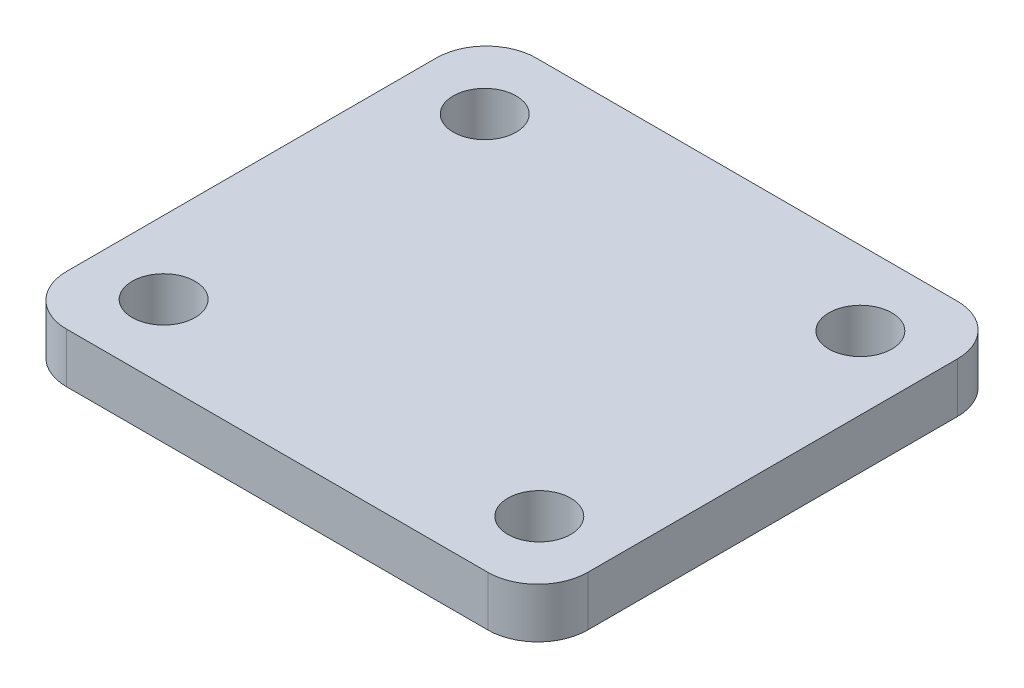
ISO-10303-21;
HEADER;
FILE_DESCRIPTION(('STEP AP214'),'2;1');
FILE_NAME('part.step','',(''),(''),'','','');
FILE_SCHEMA(('AUTOMOTIVE_DESIGN { 1 0 10303 214 1 1 1 1 }'));
ENDSEC;
DATA;
#1=APPLICATION_CONTEXT('core data for automotive mechanical design processes');
#2=APPLICATION_PROTOCOL_DEFINITION('international standard','automotive_design',2000,#1);
#3=PRODUCT_CONTEXT('',#1,'mechanical');
#4=PRODUCT('Part','Part','',(#3));
#5=PRODUCT_RELATED_PRODUCT_CATEGORY('part','',(#4));
#6=PRODUCT_DEFINITION_FORMATION('','',#4);
#7=PRODUCT_DEFINITION_CONTEXT('part definition',#1,'design');
#8=PRODUCT_DEFINITION('design','',#6,#7);
#9=PRODUCT_DEFINITION_SHAPE('','',#8);
#10=(LENGTH_UNIT() NAMED_UNIT(*) SI_UNIT(.MILLI.,.METRE.));
#11=(NAMED_UNIT(*) PLANE_ANGLE_UNIT() SI_UNIT($,.RADIAN.));
#12=(NAMED_UNIT(*) SI_UNIT($,.STERADIAN.) SOLID_ANGLE_UNIT());
#13=UNCERTAINTY_MEASURE_WITH_UNIT(LENGTH_MEASURE(1.E-05),#10,'distance_accuracy_value','');
#14=(GEOMETRIC_REPRESENTATION_CONTEXT(3) GLOBAL_UNCERTAINTY_ASSIGNED_CONTEXT((#13)) GLOBAL_UNIT_ASSIGNED_CONTEXT((#10,
#11,#12)) REPRESENTATION_CONTEXT('',''));
#15=CARTESIAN_POINT('',(0.,0.,0.));
#16=DIRECTION('',(0.,0.,1.));
#17=DIRECTION('',(1.,0.,0.));
#18=AXIS2_PLACEMENT_3D('',#15,#16,#17);
#19=CARTESIAN_POINT('',(10.709999957,2.54,-9.397499999));
#20=DIRECTION('',(0.,-1.,0.));
#21=DIRECTION('',(0.,0.,-1.));
#22=AXIS2_PLACEMENT_3D('',#19,#20,#21);
#23=CYLINDRICAL_SURFACE('',#22,2.54);
#24=CARTESIAN_POINT('',(10.709999957,0.,-9.397499999));
#25=DIRECTION('',(0.,1.,0.));
#26=DIRECTION('',(0.,0.,-1.));
#27=AXIS2_PLACEMENT_3D('',#24,#25,#26);
#28=CIRCLE('',#27,2.54);
#29=CARTESIAN_POINT('',(13.249999957,0.,-9.39749999899998));
#30=VERTEX_POINT('',#29);
#31=CARTESIAN_POINT('',(10.709999957,0.,-11.937499999));
#32=VERTEX_POINT('',#31);
#33=EDGE_CURVE('E133',#30,#32,#28,.T.);
#34=ORIENTED_EDGE('',*,*,#33,.T.);
#35=DIRECTION('',(0.,-1.,0.));
#36=VECTOR('',#35,1.);
#37=CARTESIAN_POINT('',(10.709999957,2.54,-11.937499999));
#38=LINE('',#37,#36);
#39=CARTESIAN_POINT('',(10.709999957,2.54,-11.937499999));
#40=VERTEX_POINT('',#39);
#41=EDGE_CURVE('E11',#40,#32,#38,.T.);
#42=ORIENTED_EDGE('',*,*,#41,.F.);
#43=CARTESIAN_POINT('',(10.709999957,2.54,-9.397499999));
#44=DIRECTION('',(0.,1.,0.));
#45=DIRECTION('',(0.,0.,-1.));
#46=AXIS2_PLACEMENT_3D('',#43,#44,#45);
#47=CIRCLE('',#46,2.54);
#48=CARTESIAN_POINT('',(13.249999957,2.54,-9.39749999899998));
#49=VERTEX_POINT('',#48);
#50=EDGE_CURVE('E148',#49,#40,#47,.T.);
#51=ORIENTED_EDGE('',*,*,#50,.F.);
#52=DIRECTION('',(0.,-1.,0.));
#53=VECTOR('',#52,1.);
#54=CARTESIAN_POINT('',(13.249999957,2.54,-9.39749999899998));
#55=LINE('',#54,#53);
#56=EDGE_CURVE('E129',#49,#30,#55,.T.);
#57=ORIENTED_EDGE('',*,*,#56,.T.);
#58=EDGE_LOOP('',(#34,#42,#51,#57));
#59=FACE_BOUND('',#58,.T.);
#60=ADVANCED_FACE('F37',(#59),#23,.T.);
#61=CARTESIAN_POINT('',(-10.710000043,2.54,-11.937499999));
#62=DIRECTION('',(0.,0.,1.));
#63=DIRECTION('',(1.,0.,0.));
#64=AXIS2_PLACEMENT_3D('',#61,#62,#63);
#65=PLANE('',#64);
#66=DIRECTION('',(-1.,0.,0.));
#67=VECTOR('',#66,1.);
#68=CARTESIAN_POINT('',(-10.710000043,0.,-11.937499999));
#69=LINE('',#68,#67);
#70=CARTESIAN_POINT('',(-10.710000043,0.,-11.937499999));
#71=VERTEX_POINT('',#70);
#72=EDGE_CURVE('E136',#32,#71,#69,.T.);
#73=ORIENTED_EDGE('',*,*,#72,.T.);
#74=DIRECTION('',(0.,-1.,0.));
#75=VECTOR('',#74,1.);
#76=CARTESIAN_POINT('',(-10.710000043,2.54,-11.937499999));
#77=LINE('',#76,#75);
#78=CARTESIAN_POINT('',(-10.710000043,2.54,-11.937499999));
#79=VERTEX_POINT('',#78);
#80=EDGE_CURVE('E45',#79,#71,#77,.T.);
#81=ORIENTED_EDGE('',*,*,#80,.F.);
#82=DIRECTION('',(-1.,0.,0.));
#83=VECTOR('',#82,1.);
#84=CARTESIAN_POINT('',(-10.710000043,2.54,-11.937499999));
#85=LINE('',#84,#83);
#86=EDGE_CURVE('E96',#40,#79,#85,.T.);
#87=ORIENTED_EDGE('',*,*,#86,.F.);
#88=ORIENTED_EDGE('',*,*,#41,.T.);
#89=EDGE_LOOP('',(#73,#81,#87,#88));
#90=FACE_BOUND('',#89,.T.);
#91=ADVANCED_FACE('F231',(#90),#65,.F.);
#92=CARTESIAN_POINT('',(-10.710000043,2.54,-9.397499999));
#93=DIRECTION('',(0.,-1.,0.));
#94=DIRECTION('',(0.,0.,-1.));
#95=AXIS2_PLACEMENT_3D('',#92,#93,#94);
#96=CYLINDRICAL_SURFACE('',#95,2.54);
#97=CARTESIAN_POINT('',(-10.710000043,0.,-9.397499999));
#98=DIRECTION('',(0.,1.,0.));
#99=DIRECTION('',(0.,0.,-1.));
#100=AXIS2_PLACEMENT_3D('',#97,#98,#99);
#101=CIRCLE('',#100,2.54);
#102=CARTESIAN_POINT('',(-13.250000043,0.,-9.39749999899998));
#103=VERTEX_POINT('',#102);
#104=EDGE_CURVE('E139',#71,#103,#101,.T.);
#105=ORIENTED_EDGE('',*,*,#104,.T.);
#106=DIRECTION('',(0.,-1.,0.));
#107=VECTOR('',#106,1.);
#108=CARTESIAN_POINT('',(-13.250000043,2.54,-9.39749999899998));
#109=LINE('',#108,#107);
#110=CARTESIAN_POINT('',(-13.250000043,2.54,-9.39749999899998));
#111=VERTEX_POINT('',#110);
#112=EDGE_CURVE('E155',#111,#103,#109,.T.);
#113=ORIENTED_EDGE('',*,*,#112,.F.);
#114=CARTESIAN_POINT('',(-10.710000043,2.54,-9.397499999));
#115=DIRECTION('',(0.,1.,0.));
#116=DIRECTION('',(0.,0.,-1.));
#117=AXIS2_PLACEMENT_3D('',#114,#115,#116);
#118=CIRCLE('',#117,2.54);
#119=EDGE_CURVE('E163',#79,#111,#118,.T.);
#120=ORIENTED_EDGE('',*,*,#119,.F.);
#121=ORIENTED_EDGE('',*,*,#80,.T.);
#122=EDGE_LOOP('',(#105,#113,#120,#121));
#123=FACE_BOUND('',#122,.T.);
#124=ADVANCED_FACE('F161',(#123),#96,.T.);
#125=CARTESIAN_POINT('',(-13.250000043,2.54,9.39750000099998));
#126=DIRECTION('',(1.,0.,0.));
#127=DIRECTION('',(0.,0.,-1.));
#128=AXIS2_PLACEMENT_3D('',#125,#126,#127);
#129=PLANE('',#128);
#130=DIRECTION('',(0.,0.,1.));
#131=VECTOR('',#130,1.);
#132=CARTESIAN_POINT('',(-13.250000043,0.,9.39750000099998));
#133=LINE('',#132,#131);
#134=CARTESIAN_POINT('',(-13.250000043,0.,9.39750000099998));
#135=VERTEX_POINT('',#134);
#136=EDGE_CURVE('E141',#103,#135,#133,.T.);
#137=ORIENTED_EDGE('',*,*,#136,.T.);
#138=DIRECTION('',(0.,-1.,0.));
#139=VECTOR('',#138,1.);
#140=CARTESIAN_POINT('',(-13.250000043,2.54,9.39750000099998));
#141=LINE('',#140,#139);
#142=CARTESIAN_POINT('',(-13.250000043,2.54,9.39750000099998));
#143=VERTEX_POINT('',#142);
#144=EDGE_CURVE('E152',#143,#135,#141,.T.);
#145=ORIENTED_EDGE('',*,*,#144,.F.);
#146=DIRECTION('',(0.,0.,1.));
#147=VECTOR('',#146,1.);
#148=CARTESIAN_POINT('',(-13.250000043,2.54,9.39750000099998));
#149=LINE('',#148,#147);
#150=EDGE_CURVE('E175',#111,#143,#149,.T.);
#151=ORIENTED_EDGE('',*,*,#150,.F.);
#152=ORIENTED_EDGE('',*,*,#112,.T.);
#153=EDGE_LOOP('',(#137,#145,#151,#152));
#154=FACE_BOUND('',#153,.T.);
#155=ADVANCED_FACE('F171',(#154),#129,.F.);
#156=CARTESIAN_POINT('',(-10.710000043,2.54,9.397500001));
#157=DIRECTION('',(0.,-1.,0.));
#158=DIRECTION('',(0.,0.,-1.));
#159=AXIS2_PLACEMENT_3D('',#156,#157,#158);
#160=CYLINDRICAL_SURFACE('',#159,2.54);
#161=CARTESIAN_POINT('',(-10.710000043,0.,9.397500001));
#162=DIRECTION('',(0.,1.,0.));
#163=DIRECTION('',(0.,0.,-1.));
#164=AXIS2_PLACEMENT_3D('',#161,#162,#163);
#165=CIRCLE('',#164,2.54);
#166=CARTESIAN_POINT('',(-10.710000043,0.,11.937500001));
#167=VERTEX_POINT('',#166);
#168=EDGE_CURVE('E143',#135,#167,#165,.T.);
#169=ORIENTED_EDGE('',*,*,#168,.T.);
#170=DIRECTION('',(0.,-1.,0.));
#171=VECTOR('',#170,1.);
#172=CARTESIAN_POINT('',(-10.710000043,2.54,11.937500001));
#173=LINE('',#172,#171);
#174=CARTESIAN_POINT('',(-10.710000043,2.54,11.937500001));
#175=VERTEX_POINT('',#174);
#176=EDGE_CURVE('E124',#175,#167,#173,.T.);
#177=ORIENTED_EDGE('',*,*,#176,.F.);
#178=CARTESIAN_POINT('',(-10.710000043,2.54,9.397500001));
#179=DIRECTION('',(0.,1.,0.));
#180=DIRECTION('',(0.,0.,-1.));
#181=AXIS2_PLACEMENT_3D('',#178,#179,#180);
#182=CIRCLE('',#181,2.54);
#183=EDGE_CURVE('E115',#143,#175,#182,.T.);
#184=ORIENTED_EDGE('',*,*,#183,.F.);
#185=ORIENTED_EDGE('',*,*,#144,.T.);
#186=EDGE_LOOP('',(#169,#177,#184,#185));
#187=FACE_BOUND('',#186,.T.);
#188=ADVANCED_FACE('F174',(#187),#160,.T.);
#189=CARTESIAN_POINT('',(-10.710000043,2.54,11.937500001));
#190=DIRECTION('',(0.,0.,-1.));
#191=DIRECTION('',(-1.,0.,0.));
#192=AXIS2_PLACEMENT_3D('',#189,#190,#191);
#193=PLANE('',#192);
#194=DIRECTION('',(1.,0.,0.));
#195=VECTOR('',#194,1.);
#196=CARTESIAN_POINT('',(-10.710000043,0.,11.937500001));
#197=LINE('',#196,#195);
#198=CARTESIAN_POINT('',(10.709999957,0.,11.937500001));
#199=VERTEX_POINT('',#198);
#200=EDGE_CURVE('E123',#167,#199,#197,.T.);
#201=ORIENTED_EDGE('',*,*,#200,.T.);
#202=DIRECTION('',(0.,-1.,0.));
#203=VECTOR('',#202,1.);
#204=CARTESIAN_POINT('',(10.709999957,2.54,11.937500001));
#205=LINE('',#204,#203);
#206=CARTESIAN_POINT('',(10.709999957,2.54,11.937500001));
#207=VERTEX_POINT('',#206);
#208=EDGE_CURVE('E120',#207,#199,#205,.T.);
#209=ORIENTED_EDGE('',*,*,#208,.F.);
#210=DIRECTION('',(1.,0.,0.));
#211=VECTOR('',#210,1.);
#212=CARTESIAN_POINT('',(-10.710000043,2.54,11.937500001));
#213=LINE('',#212,#211);
#214=EDGE_CURVE('E109',#175,#207,#213,.T.);
#215=ORIENTED_EDGE('',*,*,#214,.F.);
#216=ORIENTED_EDGE('',*,*,#176,.T.);
#217=EDGE_LOOP('',(#201,#209,#215,#216));
#218=FACE_BOUND('',#217,.T.);
#219=ADVANCED_FACE('F121',(#218),#193,.F.);
#220=CARTESIAN_POINT('',(10.709999957,2.54,9.397500001));
#221=DIRECTION('',(0.,-1.,0.));
#222=DIRECTION('',(0.,0.,-1.));
#223=AXIS2_PLACEMENT_3D('',#220,#221,#222);
#224=CYLINDRICAL_SURFACE('',#223,2.54);
#225=CARTESIAN_POINT('',(10.709999957,0.,9.397500001));
#226=DIRECTION('',(0.,1.,0.));
#227=DIRECTION('',(0.,0.,1.));
#228=AXIS2_PLACEMENT_3D('',#225,#226,#227);
#229=CIRCLE('',#228,2.54);
#230=CARTESIAN_POINT('',(13.249999957,0.,9.39750000099998));
#231=VERTEX_POINT('',#230);
#232=EDGE_CURVE('E82',#199,#231,#229,.T.);
#233=ORIENTED_EDGE('',*,*,#232,.T.);
#234=DIRECTION('',(0.,-1.,0.));
#235=VECTOR('',#234,1.);
#236=CARTESIAN_POINT('',(13.249999957,2.54,9.39750000099998));
#237=LINE('',#236,#235);
#238=CARTESIAN_POINT('',(13.249999957,2.54,9.39750000099998));
#239=VERTEX_POINT('',#238);
#240=EDGE_CURVE('E125',#239,#231,#237,.T.);
#241=ORIENTED_EDGE('',*,*,#240,.F.);
#242=CARTESIAN_POINT('',(10.709999957,2.54,9.397500001));
#243=DIRECTION('',(0.,1.,0.));
#244=DIRECTION('',(0.,0.,1.));
#245=AXIS2_PLACEMENT_3D('',#242,#243,#244);
#246=CIRCLE('',#245,2.54);
#247=EDGE_CURVE('E113',#207,#239,#246,.T.);
#248=ORIENTED_EDGE('',*,*,#247,.F.);
#249=ORIENTED_EDGE('',*,*,#208,.T.);
#250=EDGE_LOOP('',(#233,#241,#248,#249));
#251=FACE_BOUND('',#250,.T.);
#252=ADVANCED_FACE('F127',(#251),#224,.T.);
#253=CARTESIAN_POINT('',(13.249999957,2.54,9.39750000099998));
#254=DIRECTION('',(-1.,0.,0.));
#255=DIRECTION('',(0.,0.,1.));
#256=AXIS2_PLACEMENT_3D('',#253,#254,#255);
#257=PLANE('',#256);
#258=DIRECTION('',(0.,0.,-1.));
#259=VECTOR('',#258,1.);
#260=CARTESIAN_POINT('',(13.249999957,0.,9.39750000099998));
#261=LINE('',#260,#259);
#262=EDGE_CURVE('E88',#231,#30,#261,.T.);
#263=ORIENTED_EDGE('',*,*,#262,.T.);
#264=ORIENTED_EDGE('',*,*,#56,.F.);
#265=DIRECTION('',(0.,0.,-1.));
#266=VECTOR('',#265,1.);
#267=CARTESIAN_POINT('',(13.249999957,2.54,9.39750000099998));
#268=LINE('',#267,#266);
#269=EDGE_CURVE('E53',#239,#49,#268,.T.);
#270=ORIENTED_EDGE('',*,*,#269,.F.);
#271=ORIENTED_EDGE('',*,*,#240,.T.);
#272=EDGE_LOOP('',(#263,#264,#270,#271));
#273=FACE_BOUND('',#272,.T.);
#274=ADVANCED_FACE('F209',(#273),#257,.F.);
#275=CARTESIAN_POINT('',(10.709999957,2.54,-9.397499999));
#276=DIRECTION('',(0.,-1.,0.));
#277=DIRECTION('',(0.,0.,-1.));
#278=AXIS2_PLACEMENT_3D('',#275,#276,#277);
#279=PLANE('',#278);
#280=CARTESIAN_POINT('',(-9.54999995,2.54,8.162499942));
#281=DIRECTION('',(0.,1.,0.));
#282=DIRECTION('',(0.,0.,1.));
#283=AXIS2_PLACEMENT_3D('',#280,#281,#282);
#284=CIRCLE('',#283,1.6);
#285=CARTESIAN_POINT('',(-9.54999995,2.54,9.762499942));
#286=VERTEX_POINT('',#285);
#287=EDGE_CURVE('E190',#286,#286,#284,.T.);
#288=ORIENTED_EDGE('',*,*,#287,.F.);
#289=EDGE_LOOP('',(#288));
#290=FACE_BOUND('',#289,.T.);
#291=CARTESIAN_POINT('',(9.55000005,2.54,8.162499942));
#292=DIRECTION('',(0.,1.,0.));
#293=DIRECTION('',(0.,0.,1.));
#294=AXIS2_PLACEMENT_3D('',#291,#292,#293);
#295=CIRCLE('',#294,1.6);
#296=CARTESIAN_POINT('',(9.55000005,2.54,9.762499942));
#297=VERTEX_POINT('',#296);
#298=EDGE_CURVE('E196',#297,#297,#295,.T.);
#299=ORIENTED_EDGE('',*,*,#298,.F.);
#300=EDGE_LOOP('',(#299));
#301=FACE_BOUND('',#300,.T.);
#302=CARTESIAN_POINT('',(9.55000005,2.54,-8.162500058));
#303=DIRECTION('',(0.,1.,0.));
#304=DIRECTION('',(0.,0.,1.));
#305=AXIS2_PLACEMENT_3D('',#302,#303,#304);
#306=CIRCLE('',#305,1.6);
#307=CARTESIAN_POINT('',(9.55000005,2.54,-6.562500058));
#308=VERTEX_POINT('',#307);
#309=EDGE_CURVE('E184',#308,#308,#306,.T.);
#310=ORIENTED_EDGE('',*,*,#309,.F.);
#311=EDGE_LOOP('',(#310));
#312=FACE_BOUND('',#311,.T.);
#313=CARTESIAN_POINT('',(-9.54999995,2.54,-8.162500058));
#314=DIRECTION('',(0.,1.,0.));
#315=DIRECTION('',(0.,0.,1.));
#316=AXIS2_PLACEMENT_3D('',#313,#314,#315);
#317=CIRCLE('',#316,1.6);
#318=CARTESIAN_POINT('',(-9.54999995,2.54,-6.562500058));
#319=VERTEX_POINT('',#318);
#320=EDGE_CURVE('E181',#319,#319,#317,.T.);
#321=ORIENTED_EDGE('',*,*,#320,.F.);
#322=EDGE_LOOP('',(#321));
#323=FACE_BOUND('',#322,.T.);
#324=ORIENTED_EDGE('',*,*,#50,.T.);
#325=ORIENTED_EDGE('',*,*,#86,.T.);
#326=ORIENTED_EDGE('',*,*,#119,.T.);
#327=ORIENTED_EDGE('',*,*,#150,.T.);
#328=ORIENTED_EDGE('',*,*,#183,.T.);
#329=ORIENTED_EDGE('',*,*,#214,.T.);
#330=ORIENTED_EDGE('',*,*,#247,.T.);
#331=ORIENTED_EDGE('',*,*,#269,.T.);
#332=EDGE_LOOP('',(#324,#325,#326,#327,#328,#329,#330,#331));
#333=FACE_BOUND('',#332,.T.);
#334=ADVANCED_FACE('F111',(#290,#301,#312,#323,#333),#279,.F.);
#335=CARTESIAN_POINT('',(10.709999957,0.,-9.397499999));
#336=DIRECTION('',(0.,-1.,0.));
#337=DIRECTION('',(0.,0.,-1.));
#338=AXIS2_PLACEMENT_3D('',#335,#336,#337);
#339=PLANE('',#338);
#340=CARTESIAN_POINT('',(-9.54999995,0.,8.162499942));
#341=DIRECTION('',(0.,1.,0.));
#342=DIRECTION('',(0.,0.,1.));
#343=AXIS2_PLACEMENT_3D('',#340,#341,#342);
#344=CIRCLE('',#343,1.6);
#345=CARTESIAN_POINT('',(-9.54999995,0.,9.762499942));
#346=VERTEX_POINT('',#345);
#347=EDGE_CURVE('E187',#346,#346,#344,.T.);
#348=ORIENTED_EDGE('',*,*,#347,.T.);
#349=EDGE_LOOP('',(#348));
#350=FACE_BOUND('',#349,.T.);
#351=CARTESIAN_POINT('',(9.55000005,0.,8.162499942));
#352=DIRECTION('',(0.,1.,0.));
#353=DIRECTION('',(0.,0.,1.));
#354=AXIS2_PLACEMENT_3D('',#351,#352,#353);
#355=CIRCLE('',#354,1.6);
#356=CARTESIAN_POINT('',(9.55000005,0.,9.762499942));
#357=VERTEX_POINT('',#356);
#358=EDGE_CURVE('E193',#357,#357,#355,.T.);
#359=ORIENTED_EDGE('',*,*,#358,.T.);
#360=EDGE_LOOP('',(#359));
#361=FACE_BOUND('',#360,.T.);
#362=CARTESIAN_POINT('',(9.55000005,0.,-8.162500058));
#363=DIRECTION('',(0.,1.,0.));
#364=DIRECTION('',(0.,0.,1.));
#365=AXIS2_PLACEMENT_3D('',#362,#363,#364);
#366=CIRCLE('',#365,1.6);
#367=CARTESIAN_POINT('',(9.55000005,0.,-6.562500058));
#368=VERTEX_POINT('',#367);
#369=EDGE_CURVE('E199',#368,#368,#366,.T.);
#370=ORIENTED_EDGE('',*,*,#369,.T.);
#371=EDGE_LOOP('',(#370));
#372=FACE_BOUND('',#371,.T.);
#373=CARTESIAN_POINT('',(-9.54999995,0.,-8.162500058));
#374=DIRECTION('',(0.,1.,0.));
#375=DIRECTION('',(0.,0.,1.));
#376=AXIS2_PLACEMENT_3D('',#373,#374,#375);
#377=CIRCLE('',#376,1.6);
#378=CARTESIAN_POINT('',(-9.54999995,0.,-6.562500058));
#379=VERTEX_POINT('',#378);
#380=EDGE_CURVE('E137',#379,#379,#377,.T.);
#381=ORIENTED_EDGE('',*,*,#380,.T.);
#382=EDGE_LOOP('',(#381));
#383=FACE_BOUND('',#382,.T.);
#384=ORIENTED_EDGE('',*,*,#33,.F.);
#385=ORIENTED_EDGE('',*,*,#262,.F.);
#386=ORIENTED_EDGE('',*,*,#232,.F.);
#387=ORIENTED_EDGE('',*,*,#200,.F.);
#388=ORIENTED_EDGE('',*,*,#168,.F.);
#389=ORIENTED_EDGE('',*,*,#136,.F.);
#390=ORIENTED_EDGE('',*,*,#104,.F.);
#391=ORIENTED_EDGE('',*,*,#72,.F.);
#392=EDGE_LOOP('',(#384,#385,#386,#387,#388,#389,#390,#391));
#393=FACE_BOUND('',#392,.T.);
#394=ADVANCED_FACE('F167',(#350,#361,#372,#383,#393),#339,.T.);
#395=CARTESIAN_POINT('',(-9.54999995,0.,-8.162500058));
#396=DIRECTION('',(0.,1.,0.));
#397=DIRECTION('',(0.,0.,1.));
#398=AXIS2_PLACEMENT_3D('',#395,#396,#397);
#399=CYLINDRICAL_SURFACE('',#398,1.6);
#400=ORIENTED_EDGE('',*,*,#380,.F.);
#401=EDGE_LOOP('',(#400));
#402=FACE_BOUND('',#401,.T.);
#403=ORIENTED_EDGE('',*,*,#320,.T.);
#404=EDGE_LOOP('',(#403));
#405=FACE_BOUND('',#404,.T.);
#406=ADVANCED_FACE('F214',(#402,#405),#399,.F.);
#407=CARTESIAN_POINT('',(9.55000005,0.,-8.162500058));
#408=DIRECTION('',(0.,1.,0.));
#409=DIRECTION('',(0.,0.,1.));
#410=AXIS2_PLACEMENT_3D('',#407,#408,#409);
#411=CYLINDRICAL_SURFACE('',#410,1.6);
#412=ORIENTED_EDGE('',*,*,#369,.F.);
#413=EDGE_LOOP('',(#412));
#414=FACE_BOUND('',#413,.T.);
#415=ORIENTED_EDGE('',*,*,#309,.T.);
#416=EDGE_LOOP('',(#415));
#417=FACE_BOUND('',#416,.T.);
#418=ADVANCED_FACE('F205',(#414,#417),#411,.F.);
#419=CARTESIAN_POINT('',(9.55000005,0.,8.162499942));
#420=DIRECTION('',(0.,1.,0.));
#421=DIRECTION('',(0.,0.,1.));
#422=AXIS2_PLACEMENT_3D('',#419,#420,#421);
#423=CYLINDRICAL_SURFACE('',#422,1.6);
#424=ORIENTED_EDGE('',*,*,#358,.F.);
#425=EDGE_LOOP('',(#424));
#426=FACE_BOUND('',#425,.T.);
#427=ORIENTED_EDGE('',*,*,#298,.T.);
#428=EDGE_LOOP('',(#427));
#429=FACE_BOUND('',#428,.T.);
#430=ADVANCED_FACE('F222',(#426,#429),#423,.F.);
#431=CARTESIAN_POINT('',(-9.54999995,0.,8.162499942));
#432=DIRECTION('',(0.,1.,0.));
#433=DIRECTION('',(0.,0.,1.));
#434=AXIS2_PLACEMENT_3D('',#431,#432,#433);
#435=CYLINDRICAL_SURFACE('',#434,1.6);
#436=ORIENTED_EDGE('',*,*,#347,.F.);
#437=EDGE_LOOP('',(#436));
#438=FACE_BOUND('',#437,.T.);
#439=ORIENTED_EDGE('',*,*,#287,.T.);
#440=EDGE_LOOP('',(#439));
#441=FACE_BOUND('',#440,.T.);
#442=ADVANCED_FACE('F306',(#438,#441),#435,.F.);
#443=CLOSED_SHELL('',(#60,#91,#124,#155,#188,#219,#252,#274,#334,#394,#406,#418,#430,#442));
#444=MANIFOLD_SOLID_BREP('B2',#443);
#445=ADVANCED_BREP_SHAPE_REPRESENTATION('',(#18,#444),#14);
#446=SHAPE_DEFINITION_REPRESENTATION(#9,#445);
ENDSEC;
END-ISO-10303-21;
